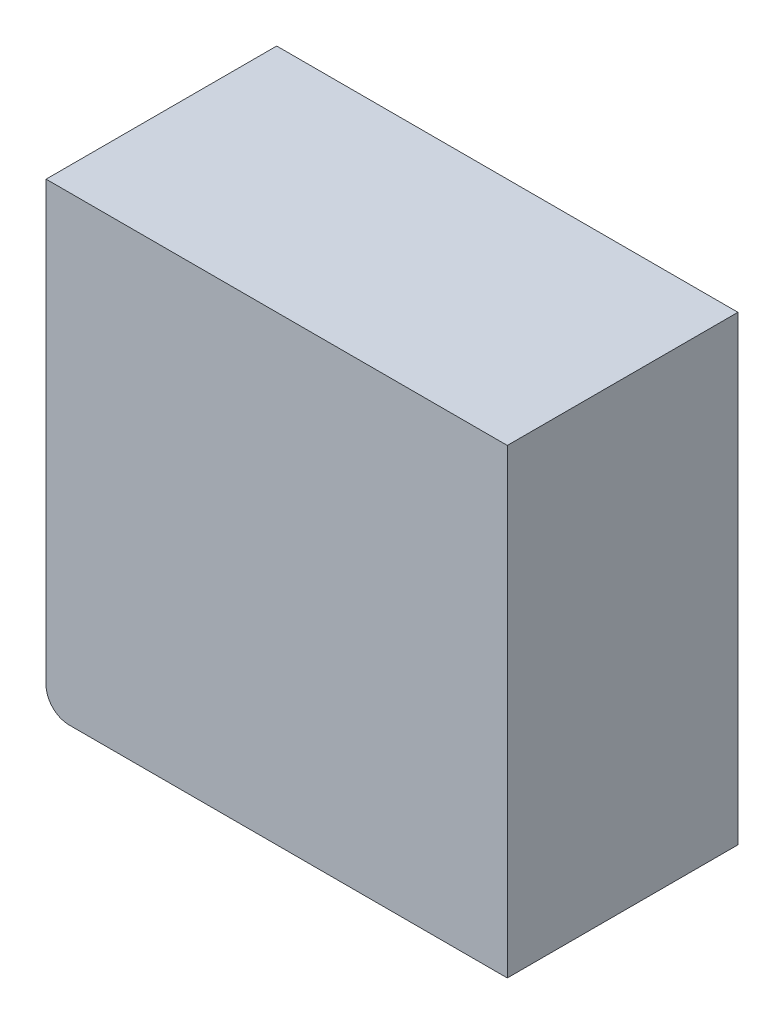
ISO-10303-21;
HEADER;
FILE_DESCRIPTION(('STEP AP214'),'2;1');
FILE_NAME('part.step','',(''),(''),'','','');
FILE_SCHEMA(('AUTOMOTIVE_DESIGN { 1 0 10303 214 1 1 1 1 }'));
ENDSEC;
DATA;
#1=APPLICATION_CONTEXT('core data for automotive mechanical design processes');
#2=APPLICATION_PROTOCOL_DEFINITION('international standard','automotive_design',2000,#1);
#3=PRODUCT_CONTEXT('',#1,'mechanical');
#4=PRODUCT('Part','Part','',(#3));
#5=PRODUCT_RELATED_PRODUCT_CATEGORY('part','',(#4));
#6=PRODUCT_DEFINITION_FORMATION('','',#4);
#7=PRODUCT_DEFINITION_CONTEXT('part definition',#1,'design');
#8=PRODUCT_DEFINITION('design','',#6,#7);
#9=PRODUCT_DEFINITION_SHAPE('','',#8);
#10=(LENGTH_UNIT() NAMED_UNIT(*) SI_UNIT(.MILLI.,.METRE.));
#11=(NAMED_UNIT(*) PLANE_ANGLE_UNIT() SI_UNIT($,.RADIAN.));
#12=(NAMED_UNIT(*) SI_UNIT($,.STERADIAN.) SOLID_ANGLE_UNIT());
#13=UNCERTAINTY_MEASURE_WITH_UNIT(LENGTH_MEASURE(1.E-05),#10,'distance_accuracy_value','');
#14=(GEOMETRIC_REPRESENTATION_CONTEXT(3) GLOBAL_UNCERTAINTY_ASSIGNED_CONTEXT((#13)) GLOBAL_UNIT_ASSIGNED_CONTEXT((#10,
#11,#12)) REPRESENTATION_CONTEXT('',''));
#15=CARTESIAN_POINT('',(0.,0.,0.));
#16=DIRECTION('',(0.,0.,1.));
#17=DIRECTION('',(1.,0.,0.));
#18=AXIS2_PLACEMENT_3D('',#15,#16,#17);
#19=CARTESIAN_POINT('',(0.,0.,10.));
#20=DIRECTION('',(1.,0.,0.));
#21=DIRECTION('',(0.,0.,-1.));
#22=AXIS2_PLACEMENT_3D('',#19,#20,#21);
#23=PLANE('',#22);
#24=DIRECTION('',(0.,-1.,0.));
#25=VECTOR('',#24,1.);
#26=CARTESIAN_POINT('',(0.,0.,0.));
#27=LINE('',#26,#25);
#28=CARTESIAN_POINT('',(0.,20.,0.));
#29=VERTEX_POINT('',#28);
#30=CARTESIAN_POINT('',(0.,3.,0.));
#31=VERTEX_POINT('',#30);
#32=EDGE_CURVE('E129',#29,#31,#27,.T.);
#33=ORIENTED_EDGE('',*,*,#32,.T.);
#34=CARTESIAN_POINT('',(0.,0.,15.));
#35=CARTESIAN_POINT('',(0.,0.333333333333333,13.3333333333333));
#36=CARTESIAN_POINT('',(0.,0.666666666666667,11.6666666666667));
#37=CARTESIAN_POINT('',(0.,1.,10.));
#38=CARTESIAN_POINT('',(0.,1.66666666666667,6.66666666666667));
#39=CARTESIAN_POINT('',(0.,2.33333333333333,3.33333333333334));
#40=CARTESIAN_POINT('',(0.,3.,0.));
#41=CARTESIAN_POINT('',(0.,4.33333333333333,-6.66666666666667));
#42=CARTESIAN_POINT('',(0.,5.66666666666667,-13.3333333333333));
#43=CARTESIAN_POINT('',(0.,7.,-20.));
#44=(BOUNDED_CURVE() B_SPLINE_CURVE(3,(#34,#35,#36,#37,#38,#39,#40,#41,#42,#43),.UNSPECIFIED.,
.F.,.F.) B_SPLINE_CURVE_WITH_KNOTS((4,3,3,4),(-0.005,0.,0.01,0.03),
.UNSPECIFIED.) CURVE() GEOMETRIC_REPRESENTATION_ITEM() RATIONAL_B_SPLINE_CURVE((1.,1.,1.,1.,1.,
1.,1.,1.,1.,1.)) REPRESENTATION_ITEM(''));
#45=CARTESIAN_POINT('',(0.,1.,10.));
#46=VERTEX_POINT('',#45);
#47=EDGE_CURVE('E63',#31,#46,#44,.F.);
#48=ORIENTED_EDGE('',*,*,#47,.T.);
#49=DIRECTION('',(0.,-1.,0.));
#50=VECTOR('',#49,1.);
#51=CARTESIAN_POINT('',(0.,0.,10.));
#52=LINE('',#51,#50);
#53=CARTESIAN_POINT('',(0.,20.,10.));
#54=VERTEX_POINT('',#53);
#55=EDGE_CURVE('E108',#54,#46,#52,.T.);
#56=ORIENTED_EDGE('',*,*,#55,.F.);
#57=DIRECTION('',(0.,0.,-1.));
#58=VECTOR('',#57,1.);
#59=CARTESIAN_POINT('',(0.,20.,10.));
#60=LINE('',#59,#58);
#61=EDGE_CURVE('E121',#54,#29,#60,.T.);
#62=ORIENTED_EDGE('',*,*,#61,.T.);
#63=EDGE_LOOP('',(#33,#48,#56,#62));
#64=FACE_BOUND('',#63,.T.);
#65=ADVANCED_FACE('F42',(#64),#23,.F.);
#66=CARTESIAN_POINT('',(0.,0.,10.));
#67=DIRECTION('',(0.,1.,0.));
#68=DIRECTION('',(0.,0.,1.));
#69=AXIS2_PLACEMENT_3D('',#66,#67,#68);
#70=PLANE('',#69);
#71=DIRECTION('',(1.,0.,0.));
#72=VECTOR('',#71,1.);
#73=CARTESIAN_POINT('',(0.,0.,10.));
#74=LINE('',#73,#72);
#75=CARTESIAN_POINT('',(1.,0.,10.));
#76=VERTEX_POINT('',#75);
#77=CARTESIAN_POINT('',(20.,0.,10.));
#78=VERTEX_POINT('',#77);
#79=EDGE_CURVE('E97',#76,#78,#74,.T.);
#80=ORIENTED_EDGE('',*,*,#79,.F.);
#81=CARTESIAN_POINT('',(0.,0.,15.));
#82=CARTESIAN_POINT('',(0.333333333333333,0.,13.3333333333333));
#83=CARTESIAN_POINT('',(0.666666666666667,0.,11.6666666666667));
#84=CARTESIAN_POINT('',(1.,0.,10.));
#85=CARTESIAN_POINT('',(1.66666666666667,0.,6.66666666666667));
#86=CARTESIAN_POINT('',(2.33333333333333,0.,3.33333333333334));
#87=CARTESIAN_POINT('',(3.,0.,0.));
#88=CARTESIAN_POINT('',(4.33333333333333,0.,-6.66666666666667));
#89=CARTESIAN_POINT('',(5.66666666666667,0.,-13.3333333333333));
#90=CARTESIAN_POINT('',(7.,0.,-20.));
#91=(BOUNDED_CURVE() B_SPLINE_CURVE(3,(#81,#82,#83,#84,#85,#86,#87,#88,#89,#90),.UNSPECIFIED.,
.F.,.F.) B_SPLINE_CURVE_WITH_KNOTS((4,3,3,4),(-0.005,0.,0.01,0.03),
.UNSPECIFIED.) CURVE() GEOMETRIC_REPRESENTATION_ITEM() RATIONAL_B_SPLINE_CURVE((1.,1.,1.,1.,1.,
1.,1.,1.,1.,1.)) REPRESENTATION_ITEM(''));
#92=CARTESIAN_POINT('',(3.,0.,0.));
#93=VERTEX_POINT('',#92);
#94=EDGE_CURVE('E119',#76,#93,#91,.T.);
#95=ORIENTED_EDGE('',*,*,#94,.T.);
#96=DIRECTION('',(1.,0.,0.));
#97=VECTOR('',#96,1.);
#98=CARTESIAN_POINT('',(0.,0.,0.));
#99=LINE('',#98,#97);
#100=CARTESIAN_POINT('',(20.,0.,0.));
#101=VERTEX_POINT('',#100);
#102=EDGE_CURVE('E111',#93,#101,#99,.T.);
#103=ORIENTED_EDGE('',*,*,#102,.T.);
#104=DIRECTION('',(0.,0.,-1.));
#105=VECTOR('',#104,1.);
#106=CARTESIAN_POINT('',(20.,0.,10.));
#107=LINE('',#106,#105);
#108=EDGE_CURVE('E115',#78,#101,#107,.T.);
#109=ORIENTED_EDGE('',*,*,#108,.F.);
#110=EDGE_LOOP('',(#80,#95,#103,#109));
#111=FACE_BOUND('',#110,.T.);
#112=ADVANCED_FACE('F114',(#111),#70,.F.);
#113=CARTESIAN_POINT('',(20.,0.,10.));
#114=DIRECTION('',(-1.,0.,0.));
#115=DIRECTION('',(0.,0.,1.));
#116=AXIS2_PLACEMENT_3D('',#113,#114,#115);
#117=PLANE('',#116);
#118=DIRECTION('',(0.,1.,0.));
#119=VECTOR('',#118,1.);
#120=CARTESIAN_POINT('',(20.,0.,0.));
#121=LINE('',#120,#119);
#122=CARTESIAN_POINT('',(20.,20.,0.));
#123=VERTEX_POINT('',#122);
#124=EDGE_CURVE('E134',#101,#123,#121,.T.);
#125=ORIENTED_EDGE('',*,*,#124,.T.);
#126=DIRECTION('',(0.,0.,-1.));
#127=VECTOR('',#126,1.);
#128=CARTESIAN_POINT('',(20.,20.,10.));
#129=LINE('',#128,#127);
#130=CARTESIAN_POINT('',(20.,20.,10.));
#131=VERTEX_POINT('',#130);
#132=EDGE_CURVE('E117',#131,#123,#129,.T.);
#133=ORIENTED_EDGE('',*,*,#132,.F.);
#134=DIRECTION('',(0.,1.,0.));
#135=VECTOR('',#134,1.);
#136=CARTESIAN_POINT('',(20.,0.,10.));
#137=LINE('',#136,#135);
#138=EDGE_CURVE('E103',#78,#131,#137,.T.);
#139=ORIENTED_EDGE('',*,*,#138,.F.);
#140=ORIENTED_EDGE('',*,*,#108,.T.);
#141=EDGE_LOOP('',(#125,#133,#139,#140));
#142=FACE_BOUND('',#141,.T.);
#143=ADVANCED_FACE('F116',(#142),#117,.F.);
#144=CARTESIAN_POINT('',(0.,20.,10.));
#145=DIRECTION('',(0.,-1.,0.));
#146=DIRECTION('',(0.,0.,-1.));
#147=AXIS2_PLACEMENT_3D('',#144,#145,#146);
#148=PLANE('',#147);
#149=DIRECTION('',(-1.,0.,0.));
#150=VECTOR('',#149,1.);
#151=CARTESIAN_POINT('',(0.,20.,0.));
#152=LINE('',#151,#150);
#153=EDGE_CURVE('E135',#123,#29,#152,.T.);
#154=ORIENTED_EDGE('',*,*,#153,.T.);
#155=ORIENTED_EDGE('',*,*,#61,.F.);
#156=DIRECTION('',(-1.,0.,0.));
#157=VECTOR('',#156,1.);
#158=CARTESIAN_POINT('',(0.,20.,10.));
#159=LINE('',#158,#157);
#160=EDGE_CURVE('E122',#131,#54,#159,.T.);
#161=ORIENTED_EDGE('',*,*,#160,.F.);
#162=ORIENTED_EDGE('',*,*,#132,.T.);
#163=EDGE_LOOP('',(#154,#155,#161,#162));
#164=FACE_BOUND('',#163,.T.);
#165=ADVANCED_FACE('F160',(#164),#148,.F.);
#166=CARTESIAN_POINT('',(0.,0.,10.));
#167=DIRECTION('',(0.,0.,-1.));
#168=DIRECTION('',(-1.,0.,0.));
#169=AXIS2_PLACEMENT_3D('',#166,#167,#168);
#170=PLANE('',#169);
#171=ORIENTED_EDGE('',*,*,#55,.T.);
#172=CARTESIAN_POINT('',(0.,1.,10.));
#173=CARTESIAN_POINT('',(2.00382272919838E-07,0.971865254433033,10.));
#174=CARTESIAN_POINT('',(0.00118809679071124,0.943743998294724,10.));
#175=CARTESIAN_POINT('',(0.00592711504370786,0.887702683671552,10.));
#176=CARTESIAN_POINT('',(0.0094781263599044,0.859782615838378,10.));
#177=CARTESIAN_POINT('',(0.0236421542766377,0.776673062714859,10.));
#178=CARTESIAN_POINT('',(0.0377662582323773,0.722040247925387,10.));
#179=CARTESIAN_POINT('',(0.0749850962649837,0.615923079973814,10.));
#180=CARTESIAN_POINT('',(0.0980841377473432,0.56444025236076,10.));
#181=CARTESIAN_POINT('',(0.15259695811507,0.46608392399667,10.));
#182=CARTESIAN_POINT('',(0.184009272254501,0.419209613247646,10.));
#183=CARTESIAN_POINT('',(0.254252908299766,0.331400542138711,10.));
#184=CARTESIAN_POINT('',(0.293084942991147,0.290466353089954,10.));
#185=CARTESIAN_POINT('',(0.377095803868663,0.215686012738736,10.));
#186=CARTESIAN_POINT('',(0.422274527732505,0.181839747185597,10.));
#187=CARTESIAN_POINT('',(0.493789005279505,0.137129745737318,10.));
#188=CARTESIAN_POINT('',(0.518273097453736,0.123227438478942,10.));
#189=CARTESIAN_POINT('',(0.568300426426201,0.0975446186435082,10.));
#190=CARTESIAN_POINT('',(0.593842701658528,0.085762229568652,10.));
#191=CARTESIAN_POINT('',(0.671820372696968,0.0537191639679019,10.));
#192=CARTESIAN_POINT('',(0.72565639997681,0.0367315233233097,10.));
#193=CARTESIAN_POINT('',(0.816509408823339,0.0162826143834515,10.));
#194=CARTESIAN_POINT('',(0.852963997924948,0.0101806058721732,10.));
#195=CARTESIAN_POINT('',(0.926271674500714,0.00204095716115064,10.));
#196=CARTESIAN_POINT('',(0.96312412224461,-2.44500347913848E-06,10.));
#197=CARTESIAN_POINT('',(1.,0.,10.));
#198=B_SPLINE_CURVE_WITH_KNOTS('',3,(#172,#173,#174,#175,#176,#177,#178,#179,#180,#181,#182,
#183,#184,#185,#186,#187,#188,#189,#190,#191,#192,#193,#194,#195,#196,#197),.UNSPECIFIED.,.F.,
.F.,(4,2,2,2,2,2,2,2,2,2,2,2,4),(0.,0.08435237196819,0.16870079885769,0.337119301180074,
0.505618733833116,0.674088497697071,0.842574453982505,1.01105769422328,1.09543727445716,
1.17974179257318,1.34817695086762,1.45885920377383,1.56938420949947),.UNSPECIFIED.);
#199=EDGE_CURVE('E11',#46,#76,#198,.T.);
#200=ORIENTED_EDGE('',*,*,#199,.T.);
#201=ORIENTED_EDGE('',*,*,#79,.T.);
#202=ORIENTED_EDGE('',*,*,#138,.T.);
#203=ORIENTED_EDGE('',*,*,#160,.T.);
#204=EDGE_LOOP('',(#171,#200,#201,#202,#203));
#205=FACE_BOUND('',#204,.T.);
#206=ADVANCED_FACE('F101',(#205),#170,.F.);
#207=CARTESIAN_POINT('',(0.,0.,0.));
#208=DIRECTION('',(0.,0.,-1.));
#209=DIRECTION('',(-1.,0.,0.));
#210=AXIS2_PLACEMENT_3D('',#207,#208,#209);
#211=PLANE('',#210);
#212=ORIENTED_EDGE('',*,*,#102,.F.);
#213=CARTESIAN_POINT('',(3.,0.,0.));
#214=CARTESIAN_POINT('',(2.91562013649833,-8.08512068483166E-06,0.));
#215=CARTESIAN_POINT('',(2.8312441052389,0.00355995162454987,0.));
#216=CARTESIAN_POINT('',(2.66309573936865,0.0177857007461225,0.));
#217=CARTESIAN_POINT('',(2.57932337599362,0.0284430730339614,0.));
#218=CARTESIAN_POINT('',(2.41303301905116,0.0567742285138056,0.));
#219=CARTESIAN_POINT('',(2.33051412549025,0.0744427038969529,0.));
#220=CARTESIAN_POINT('',(2.16727818478174,0.116652747337002,0.));
#221=CARTESIAN_POINT('',(2.08656111565192,0.141194231493787,0.));
#222=CARTESIAN_POINT('',(1.84789145711202,0.224929944623922,0.));
#223=CARTESIAN_POINT('',(1.69335274509183,0.294247025076762,0.));
#224=CARTESIAN_POINT('',(1.39821978961279,0.457796261561747,0.));
#225=CARTESIAN_POINT('',(1.25762309565199,0.552024028485741,0.));
#226=CARTESIAN_POINT('',(0.994221314761601,0.762751358266629,0.));
#227=CARTESIAN_POINT('',(0.871416054220721,0.879250703768606,0.));
#228=CARTESIAN_POINT('',(0.647088707336877,1.13123799410192,0.));
#229=CARTESIAN_POINT('',(0.545570789256994,1.2667296491574,0.));
#230=CARTESIAN_POINT('',(0.366707769393535,1.55284733809731,0.));
#231=CARTESIAN_POINT('',(0.289367400071088,1.70347632731553,0.));
#232=CARTESIAN_POINT('',(0.161113391347137,2.01555094289524,0.));
#233=CARTESIAN_POINT('',(0.110184273862289,2.17699017122708,0.));
#234=CARTESIAN_POINT('',(0.048854608937268,2.44951444579392,0.));
#235=CARTESIAN_POINT('',(0.0305451981052155,2.55888510833486,0.));
#236=CARTESIAN_POINT('',(0.00611949579744254,2.77882189915993,0.));
#237=CARTESIAN_POINT('',(-1.40815865906668E-05,2.8893861082811,0.));
#238=CARTESIAN_POINT('',(0.,3.,0.));
#239=B_SPLINE_CURVE_WITH_KNOTS('',3,(#213,#214,#215,#216,#217,#218,#219,#220,#221,#222,#223,
#224,#225,#226,#227,#228,#229,#230,#231,#232,#233,#234,#235,#236,#237,#238),.UNSPECIFIED.,.F.,
.F.,(4,2,2,2,2,2,2,2,2,2,2,2,4),(0.,0.253057267660729,0.506102396573057,0.758956320118767,
1.01180715716335,1.51730545512248,2.02271474671434,2.52811910611937,3.03362233625863,
3.53922445064323,4.04452992552656,4.37657668424518,4.70815170142211),.UNSPECIFIED.);
#240=EDGE_CURVE('E73',#93,#31,#239,.T.);
#241=ORIENTED_EDGE('',*,*,#240,.T.);
#242=ORIENTED_EDGE('',*,*,#32,.F.);
#243=ORIENTED_EDGE('',*,*,#153,.F.);
#244=ORIENTED_EDGE('',*,*,#124,.F.);
#245=EDGE_LOOP('',(#212,#241,#242,#243,#244));
#246=FACE_BOUND('',#245,.T.);
#247=ADVANCED_FACE('F155',(#246),#211,.T.);
#248=CARTESIAN_POINT('',(0.600000000000001,0.,12.));
#249=CARTESIAN_POINT('',(0.733333333333334,0.,11.3333333333333));
#250=CARTESIAN_POINT('',(0.866666666666667,0.,10.6666666666667));
#251=CARTESIAN_POINT('',(1.,0.,10.));
#252=CARTESIAN_POINT('',(1.66666666666667,0.,6.66666666666667));
#253=CARTESIAN_POINT('',(2.33333333333333,0.,3.33333333333334));
#254=CARTESIAN_POINT('',(3.,0.,0.));
#255=CARTESIAN_POINT('',(3.13333333333333,0.,-0.666666666666667));
#256=CARTESIAN_POINT('',(3.26666666666667,0.,-1.33333333333334));
#257=CARTESIAN_POINT('',(3.4,0.,-2.));
#258=CARTESIAN_POINT('',(0.,0.,12.));
#259=CARTESIAN_POINT('',(0.,0.,11.3333333333333));
#260=CARTESIAN_POINT('',(0.,0.,10.6666666666667));
#261=CARTESIAN_POINT('',(0.,0.,10.));
#262=CARTESIAN_POINT('',(0.,0.,6.66666666666667));
#263=CARTESIAN_POINT('',(0.,0.,3.33333333333334));
#264=CARTESIAN_POINT('',(0.,0.,0.));
#265=CARTESIAN_POINT('',(0.,0.,-0.666666666666667));
#266=CARTESIAN_POINT('',(0.,0.,-1.33333333333334));
#267=CARTESIAN_POINT('',(0.,0.,-2.));
#268=CARTESIAN_POINT('',(0.,0.600000000000001,12.));
#269=CARTESIAN_POINT('',(0.,0.733333333333334,11.3333333333333));
#270=CARTESIAN_POINT('',(0.,0.866666666666667,10.6666666666667));
#271=CARTESIAN_POINT('',(0.,1.,10.));
#272=CARTESIAN_POINT('',(0.,1.66666666666667,6.66666666666667));
#273=CARTESIAN_POINT('',(0.,2.33333333333333,3.33333333333334));
#274=CARTESIAN_POINT('',(0.,3.,0.));
#275=CARTESIAN_POINT('',(0.,3.13333333333333,-0.666666666666667));
#276=CARTESIAN_POINT('',(0.,3.26666666666667,-1.33333333333334));
#277=CARTESIAN_POINT('',(0.,3.4,-2.));
#278=(BOUNDED_SURFACE() B_SPLINE_SURFACE(2,3,((#248,#249,#250,#251,#252,#253,#254,#255,#256,
#257),(#258,#259,#260,#261,#262,#263,#264,#265,#266,#267),(#268,#269,#270,#271,#272,#273,#274,
#275,#276,#277)),.UNSPECIFIED.,.F.,.F.,.F.) B_SPLINE_SURFACE_WITH_KNOTS((3,3),(4,3,3,4),(0.,1.),
(-0.002,0.,0.01,0.012),
.UNSPECIFIED.) GEOMETRIC_REPRESENTATION_ITEM() RATIONAL_B_SPLINE_SURFACE(((1.,1.,1.,1.,1.,1.,1.,
1.,1.,1.),(0.707106781186548,0.707106781186548,0.707106781186548,0.707106781186548,
0.707106781186548,0.707106781186548,0.707106781186548,0.707106781186548,0.707106781186548,
0.707106781186548),(1.,1.,1.,1.,1.,1.,1.,1.,1.,1.))) REPRESENTATION_ITEM('') SURFACE());
#279=ORIENTED_EDGE('',*,*,#199,.F.);
#280=ORIENTED_EDGE('',*,*,#47,.F.);
#281=ORIENTED_EDGE('',*,*,#240,.F.);
#282=ORIENTED_EDGE('',*,*,#94,.F.);
#283=EDGE_LOOP('',(#279,#280,#281,#282));
#284=FACE_BOUND('',#283,.T.);
#285=ADVANCED_FACE('F50',(#284),#278,.T.);
#286=CLOSED_SHELL('',(#65,#112,#143,#165,#206,#247,#285));
#287=MANIFOLD_SOLID_BREP('B2',#286);
#288=ADVANCED_BREP_SHAPE_REPRESENTATION('',(#18,#287),#14);
#289=SHAPE_DEFINITION_REPRESENTATION(#9,#288);
ENDSEC;
END-ISO-10303-21;
